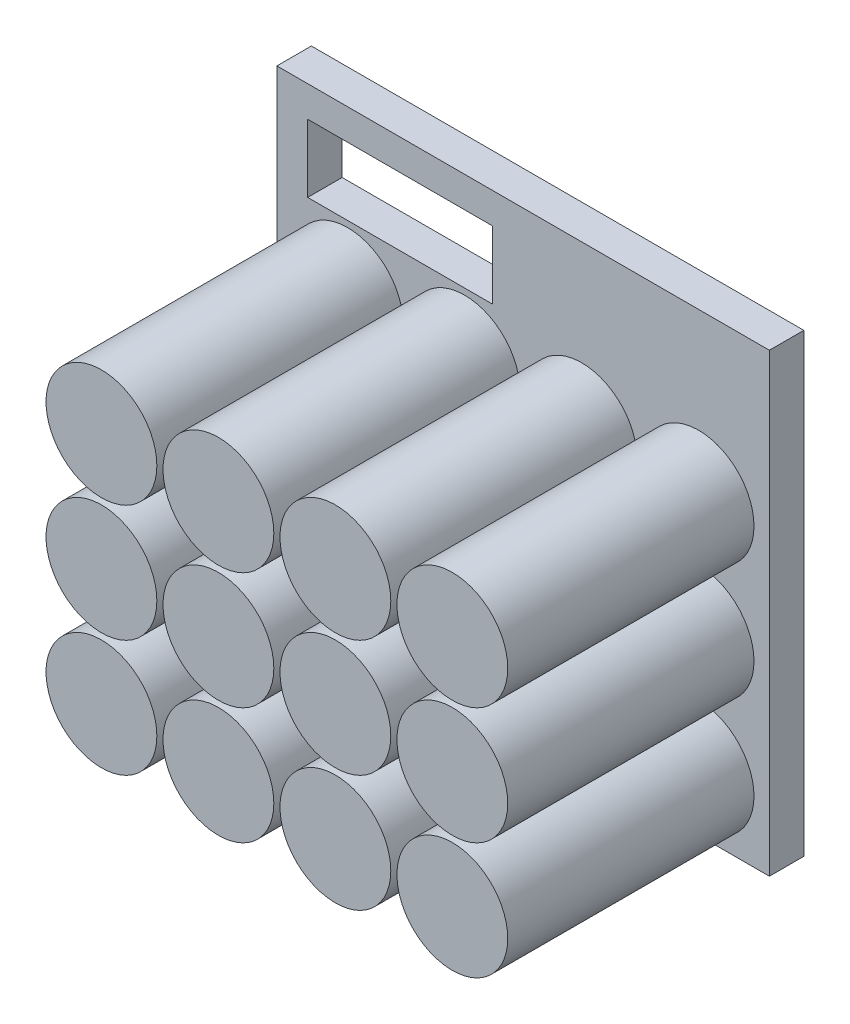
ISO-10303-21;
HEADER;
FILE_DESCRIPTION(('STEP AP214'),'2;1');
FILE_NAME('part.step','',(''),(''),'','','');
FILE_SCHEMA(('AUTOMOTIVE_DESIGN { 1 0 10303 214 1 1 1 1 }'));
ENDSEC;
DATA;
#1=APPLICATION_CONTEXT('core data for automotive mechanical design processes');
#2=APPLICATION_PROTOCOL_DEFINITION('international standard','automotive_design',2000,#1);
#3=PRODUCT_CONTEXT('',#1,'mechanical');
#4=PRODUCT('Part','Part','',(#3));
#5=PRODUCT_RELATED_PRODUCT_CATEGORY('part','',(#4));
#6=PRODUCT_DEFINITION_FORMATION('','',#4);
#7=PRODUCT_DEFINITION_CONTEXT('part definition',#1,'design');
#8=PRODUCT_DEFINITION('design','',#6,#7);
#9=PRODUCT_DEFINITION_SHAPE('','',#8);
#10=(LENGTH_UNIT() NAMED_UNIT(*) SI_UNIT(.MILLI.,.METRE.));
#11=(NAMED_UNIT(*) PLANE_ANGLE_UNIT() SI_UNIT($,.RADIAN.));
#12=(NAMED_UNIT(*) SI_UNIT($,.STERADIAN.) SOLID_ANGLE_UNIT());
#13=UNCERTAINTY_MEASURE_WITH_UNIT(LENGTH_MEASURE(1.E-05),#10,'distance_accuracy_value','');
#14=(GEOMETRIC_REPRESENTATION_CONTEXT(3) GLOBAL_UNCERTAINTY_ASSIGNED_CONTEXT((#13)) GLOBAL_UNIT_ASSIGNED_CONTEXT((#10,
#11,#12)) REPRESENTATION_CONTEXT('',''));
#15=CARTESIAN_POINT('',(0.,0.,0.));
#16=DIRECTION('',(0.,0.,1.));
#17=DIRECTION('',(1.,0.,0.));
#18=AXIS2_PLACEMENT_3D('',#15,#16,#17);
#19=CARTESIAN_POINT('',(-35.0248756218906,13.6567164179105,-5.6));
#20=DIRECTION('',(-1.,0.,0.));
#21=DIRECTION('',(0.,-1.,0.));
#22=AXIS2_PLACEMENT_3D('',#19,#20,#21);
#23=PLANE('',#22);
#24=DIRECTION('',(0.,-1.,0.));
#25=VECTOR('',#24,1.);
#26=CARTESIAN_POINT('',(-35.0248756218906,13.6567164179105,0.));
#27=LINE('',#26,#25);
#28=CARTESIAN_POINT('',(-35.0248756218906,13.6567164179105,0.));
#29=VERTEX_POINT('',#28);
#30=CARTESIAN_POINT('',(-35.0248756218906,-60.3432835820895,0.));
#31=VERTEX_POINT('',#30);
#32=EDGE_CURVE('E137',#29,#31,#27,.T.);
#33=ORIENTED_EDGE('',*,*,#32,.F.);
#34=DIRECTION('',(0.,0.,1.));
#35=VECTOR('',#34,1.);
#36=CARTESIAN_POINT('',(-35.0248756218906,13.6567164179105,-5.6));
#37=LINE('',#36,#35);
#38=CARTESIAN_POINT('',(-35.0248756218906,13.6567164179105,-5.6));
#39=VERTEX_POINT('',#38);
#40=EDGE_CURVE('E11',#39,#29,#37,.T.);
#41=ORIENTED_EDGE('',*,*,#40,.F.);
#42=DIRECTION('',(0.,-1.,0.));
#43=VECTOR('',#42,1.);
#44=CARTESIAN_POINT('',(-35.0248756218906,13.6567164179105,-5.6));
#45=LINE('',#44,#43);
#46=CARTESIAN_POINT('',(-35.0248756218906,-60.3432835820895,-5.6));
#47=VERTEX_POINT('',#46);
#48=EDGE_CURVE('E141',#39,#47,#45,.T.);
#49=ORIENTED_EDGE('',*,*,#48,.T.);
#50=DIRECTION('',(0.,0.,1.));
#51=VECTOR('',#50,1.);
#52=CARTESIAN_POINT('',(-35.0248756218906,-60.3432835820895,-5.6));
#53=LINE('',#52,#51);
#54=EDGE_CURVE('E38',#47,#31,#53,.T.);
#55=ORIENTED_EDGE('',*,*,#54,.T.);
#56=EDGE_LOOP('',(#33,#41,#49,#55));
#57=FACE_BOUND('',#56,.T.);
#58=ADVANCED_FACE('F35',(#57),#23,.T.);
#59=CARTESIAN_POINT('',(-35.0248756218906,13.6567164179105,-5.6));
#60=DIRECTION('',(0.,1.,0.));
#61=DIRECTION('',(0.,0.,1.));
#62=AXIS2_PLACEMENT_3D('',#59,#60,#61);
#63=PLANE('',#62);
#64=DIRECTION('',(-1.,0.,0.));
#65=VECTOR('',#64,1.);
#66=CARTESIAN_POINT('',(-35.0248756218906,13.6567164179105,0.));
#67=LINE('',#66,#65);
#68=CARTESIAN_POINT('',(44.9751243781094,13.6567164179105,0.));
#69=VERTEX_POINT('',#68);
#70=EDGE_CURVE('E145',#69,#29,#67,.T.);
#71=ORIENTED_EDGE('',*,*,#70,.F.);
#72=DIRECTION('',(0.,0.,1.));
#73=VECTOR('',#72,1.);
#74=CARTESIAN_POINT('',(44.9751243781094,13.6567164179105,-5.6));
#75=LINE('',#74,#73);
#76=CARTESIAN_POINT('',(44.9751243781094,13.6567164179105,-5.6));
#77=VERTEX_POINT('',#76);
#78=EDGE_CURVE('E43',#77,#69,#75,.T.);
#79=ORIENTED_EDGE('',*,*,#78,.F.);
#80=DIRECTION('',(-1.,0.,0.));
#81=VECTOR('',#80,1.);
#82=CARTESIAN_POINT('',(-35.0248756218906,13.6567164179105,-5.6));
#83=LINE('',#82,#81);
#84=EDGE_CURVE('E151',#77,#39,#83,.T.);
#85=ORIENTED_EDGE('',*,*,#84,.T.);
#86=ORIENTED_EDGE('',*,*,#40,.T.);
#87=EDGE_LOOP('',(#71,#79,#85,#86));
#88=FACE_BOUND('',#87,.T.);
#89=ADVANCED_FACE('F177',(#88),#63,.T.);
#90=CARTESIAN_POINT('',(44.9751243781094,13.6567164179105,-5.6));
#91=DIRECTION('',(1.,0.,0.));
#92=DIRECTION('',(0.,1.,0.));
#93=AXIS2_PLACEMENT_3D('',#90,#91,#92);
#94=PLANE('',#93);
#95=DIRECTION('',(0.,1.,0.));
#96=VECTOR('',#95,1.);
#97=CARTESIAN_POINT('',(44.9751243781094,13.6567164179105,0.));
#98=LINE('',#97,#96);
#99=CARTESIAN_POINT('',(44.9751243781094,-60.3432835820895,0.));
#100=VERTEX_POINT('',#99);
#101=EDGE_CURVE('E159',#100,#69,#98,.T.);
#102=ORIENTED_EDGE('',*,*,#101,.F.);
#103=DIRECTION('',(0.,0.,1.));
#104=VECTOR('',#103,1.);
#105=CARTESIAN_POINT('',(44.9751243781094,-60.3432835820895,-5.6));
#106=LINE('',#105,#104);
#107=CARTESIAN_POINT('',(44.9751243781094,-60.3432835820895,-5.6));
#108=VERTEX_POINT('',#107);
#109=EDGE_CURVE('E164',#108,#100,#106,.T.);
#110=ORIENTED_EDGE('',*,*,#109,.F.);
#111=DIRECTION('',(0.,1.,0.));
#112=VECTOR('',#111,1.);
#113=CARTESIAN_POINT('',(44.9751243781094,13.6567164179105,-5.6));
#114=LINE('',#113,#112);
#115=EDGE_CURVE('E148',#108,#77,#114,.T.);
#116=ORIENTED_EDGE('',*,*,#115,.T.);
#117=ORIENTED_EDGE('',*,*,#78,.T.);
#118=EDGE_LOOP('',(#102,#110,#116,#117));
#119=FACE_BOUND('',#118,.T.);
#120=ADVANCED_FACE('F181',(#119),#94,.T.);
#121=CARTESIAN_POINT('',(-35.0248756218906,-60.3432835820895,-5.6));
#122=DIRECTION('',(0.,-1.,0.));
#123=DIRECTION('',(0.,0.,-1.));
#124=AXIS2_PLACEMENT_3D('',#121,#122,#123);
#125=PLANE('',#124);
#126=DIRECTION('',(1.,0.,0.));
#127=VECTOR('',#126,1.);
#128=CARTESIAN_POINT('',(-35.0248756218906,-60.3432835820895,0.));
#129=LINE('',#128,#127);
#130=EDGE_CURVE('E156',#31,#100,#129,.T.);
#131=ORIENTED_EDGE('',*,*,#130,.F.);
#132=ORIENTED_EDGE('',*,*,#54,.F.);
#133=DIRECTION('',(1.,0.,0.));
#134=VECTOR('',#133,1.);
#135=CARTESIAN_POINT('',(-35.0248756218906,-60.3432835820895,-5.6));
#136=LINE('',#135,#134);
#137=EDGE_CURVE('E144',#47,#108,#136,.T.);
#138=ORIENTED_EDGE('',*,*,#137,.T.);
#139=ORIENTED_EDGE('',*,*,#109,.T.);
#140=EDGE_LOOP('',(#131,#132,#138,#139));
#141=FACE_BOUND('',#140,.T.);
#142=ADVANCED_FACE('F172',(#141),#125,.T.);
#143=CARTESIAN_POINT('',(0.,0.,-5.6));
#144=DIRECTION('',(0.,0.,1.));
#145=DIRECTION('',(1.,0.,0.));
#146=AXIS2_PLACEMENT_3D('',#143,#144,#145);
#147=PLANE('',#146);
#148=DIRECTION('',(-1.,0.,0.));
#149=VECTOR('',#148,1.);
#150=CARTESIAN_POINT('',(-30.0248756218906,8.65671641791045,-5.6));
#151=LINE('',#150,#149);
#152=CARTESIAN_POINT('',(-0.0248756218905726,8.65671641791045,-5.6));
#153=VERTEX_POINT('',#152);
#154=CARTESIAN_POINT('',(-30.0248756218906,8.65671641791045,-5.6));
#155=VERTEX_POINT('',#154);
#156=EDGE_CURVE('E108',#153,#155,#151,.T.);
#157=ORIENTED_EDGE('',*,*,#156,.T.);
#158=DIRECTION('',(0.,-1.,0.));
#159=VECTOR('',#158,1.);
#160=CARTESIAN_POINT('',(-30.0248756218906,8.65671641791045,-5.6));
#161=LINE('',#160,#159);
#162=CARTESIAN_POINT('',(-30.0248756218906,-2.34328358208955,-5.6));
#163=VERTEX_POINT('',#162);
#164=EDGE_CURVE('E102',#155,#163,#161,.T.);
#165=ORIENTED_EDGE('',*,*,#164,.T.);
#166=DIRECTION('',(1.,0.,0.));
#167=VECTOR('',#166,1.);
#168=CARTESIAN_POINT('',(-30.0248756218906,-2.34328358208955,-5.6));
#169=LINE('',#168,#167);
#170=CARTESIAN_POINT('',(-0.0248756218905674,-2.34328358208955,-5.6));
#171=VERTEX_POINT('',#170);
#172=EDGE_CURVE('E111',#163,#171,#169,.T.);
#173=ORIENTED_EDGE('',*,*,#172,.T.);
#174=DIRECTION('',(0.,1.,0.));
#175=VECTOR('',#174,1.);
#176=CARTESIAN_POINT('',(-0.0248756218905726,8.65671641791045,-5.6));
#177=LINE('',#176,#175);
#178=EDGE_CURVE('E51',#171,#153,#177,.T.);
#179=ORIENTED_EDGE('',*,*,#178,.T.);
#180=EDGE_LOOP('',(#157,#165,#173,#179));
#181=FACE_BOUND('',#180,.T.);
#182=ORIENTED_EDGE('',*,*,#48,.F.);
#183=ORIENTED_EDGE('',*,*,#84,.F.);
#184=ORIENTED_EDGE('',*,*,#115,.F.);
#185=ORIENTED_EDGE('',*,*,#137,.F.);
#186=EDGE_LOOP('',(#182,#183,#184,#185));
#187=FACE_BOUND('',#186,.T.);
#188=ADVANCED_FACE('F115',(#181,#187),#147,.F.);
#189=CARTESIAN_POINT('',(0.,0.,0.));
#190=DIRECTION('',(0.,0.,1.));
#191=DIRECTION('',(1.,0.,0.));
#192=AXIS2_PLACEMENT_3D('',#189,#190,#191);
#193=PLANE('',#192);
#194=CARTESIAN_POINT('',(33.4751243781094,-50.3432835820895,0.));
#195=DIRECTION('',(0.,0.,1.));
#196=DIRECTION('',(1.,0.,0.));
#197=AXIS2_PLACEMENT_3D('',#194,#195,#196);
#198=CIRCLE('',#197,9.);
#199=CARTESIAN_POINT('',(42.4751243781094,-50.3432835820895,0.));
#200=VERTEX_POINT('',#199);
#201=EDGE_CURVE('E506',#200,#200,#198,.T.);
#202=ORIENTED_EDGE('',*,*,#201,.F.);
#203=EDGE_LOOP('',(#202));
#204=FACE_BOUND('',#203,.T.);
#205=CARTESIAN_POINT('',(33.4751243781094,-31.3432835820895,0.));
#206=DIRECTION('',(0.,0.,1.));
#207=DIRECTION('',(1.,0.,0.));
#208=AXIS2_PLACEMENT_3D('',#205,#206,#207);
#209=CIRCLE('',#208,9.);
#210=CARTESIAN_POINT('',(42.4751243781094,-31.3432835820895,0.));
#211=VERTEX_POINT('',#210);
#212=EDGE_CURVE('E505',#211,#211,#209,.T.);
#213=ORIENTED_EDGE('',*,*,#212,.F.);
#214=EDGE_LOOP('',(#213));
#215=FACE_BOUND('',#214,.T.);
#216=CARTESIAN_POINT('',(33.4751243781093,-12.3432835820895,0.));
#217=DIRECTION('',(0.,0.,1.));
#218=DIRECTION('',(1.,0.,0.));
#219=AXIS2_PLACEMENT_3D('',#216,#217,#218);
#220=CIRCLE('',#219,9.);
#221=CARTESIAN_POINT('',(42.4751243781093,-12.3432835820895,0.));
#222=VERTEX_POINT('',#221);
#223=EDGE_CURVE('E515',#222,#222,#220,.T.);
#224=ORIENTED_EDGE('',*,*,#223,.F.);
#225=EDGE_LOOP('',(#224));
#226=FACE_BOUND('',#225,.T.);
#227=CARTESIAN_POINT('',(14.4751243781093,-12.3432835820895,0.));
#228=DIRECTION('',(0.,0.,1.));
#229=DIRECTION('',(1.,0.,0.));
#230=AXIS2_PLACEMENT_3D('',#227,#228,#229);
#231=CIRCLE('',#230,9.);
#232=CARTESIAN_POINT('',(23.4751243781093,-12.3432835820895,0.));
#233=VERTEX_POINT('',#232);
#234=EDGE_CURVE('E520',#233,#233,#231,.T.);
#235=ORIENTED_EDGE('',*,*,#234,.F.);
#236=EDGE_LOOP('',(#235));
#237=FACE_BOUND('',#236,.T.);
#238=CARTESIAN_POINT('',(14.4751243781094,-31.3432835820895,0.));
#239=DIRECTION('',(0.,0.,1.));
#240=DIRECTION('',(1.,0.,0.));
#241=AXIS2_PLACEMENT_3D('',#238,#239,#240);
#242=CIRCLE('',#241,9.);
#243=CARTESIAN_POINT('',(23.4751243781094,-31.3432835820895,0.));
#244=VERTEX_POINT('',#243);
#245=EDGE_CURVE('E526',#244,#244,#242,.T.);
#246=ORIENTED_EDGE('',*,*,#245,.F.);
#247=EDGE_LOOP('',(#246));
#248=FACE_BOUND('',#247,.T.);
#249=CARTESIAN_POINT('',(14.4751243781094,-50.3432835820895,0.));
#250=DIRECTION('',(0.,0.,1.));
#251=DIRECTION('',(1.,0.,0.));
#252=AXIS2_PLACEMENT_3D('',#249,#250,#251);
#253=CIRCLE('',#252,9.);
#254=CARTESIAN_POINT('',(23.4751243781094,-50.3432835820895,0.));
#255=VERTEX_POINT('',#254);
#256=EDGE_CURVE('E532',#255,#255,#253,.T.);
#257=ORIENTED_EDGE('',*,*,#256,.F.);
#258=EDGE_LOOP('',(#257));
#259=FACE_BOUND('',#258,.T.);
#260=CARTESIAN_POINT('',(-4.52487562189056,-50.3432835820895,0.));
#261=DIRECTION('',(0.,0.,1.));
#262=DIRECTION('',(1.,0.,0.));
#263=AXIS2_PLACEMENT_3D('',#260,#261,#262);
#264=CIRCLE('',#263,9.);
#265=CARTESIAN_POINT('',(4.47512437810944,-50.3432835820895,0.));
#266=VERTEX_POINT('',#265);
#267=EDGE_CURVE('E538',#266,#266,#264,.T.);
#268=ORIENTED_EDGE('',*,*,#267,.F.);
#269=EDGE_LOOP('',(#268));
#270=FACE_BOUND('',#269,.T.);
#271=CARTESIAN_POINT('',(-4.52487562189063,-31.3432835820895,0.));
#272=DIRECTION('',(0.,0.,1.));
#273=DIRECTION('',(1.,0.,0.));
#274=AXIS2_PLACEMENT_3D('',#271,#272,#273);
#275=CIRCLE('',#274,9.);
#276=CARTESIAN_POINT('',(4.47512437810937,-31.3432835820895,0.));
#277=VERTEX_POINT('',#276);
#278=EDGE_CURVE('E544',#277,#277,#275,.T.);
#279=ORIENTED_EDGE('',*,*,#278,.F.);
#280=EDGE_LOOP('',(#279));
#281=FACE_BOUND('',#280,.T.);
#282=CARTESIAN_POINT('',(-4.52487562189069,-12.3432835820895,0.));
#283=DIRECTION('',(0.,0.,1.));
#284=DIRECTION('',(1.,0.,0.));
#285=AXIS2_PLACEMENT_3D('',#282,#283,#284);
#286=CIRCLE('',#285,9.);
#287=CARTESIAN_POINT('',(4.47512437810931,-12.3432835820895,0.));
#288=VERTEX_POINT('',#287);
#289=EDGE_CURVE('E550',#288,#288,#286,.T.);
#290=ORIENTED_EDGE('',*,*,#289,.F.);
#291=EDGE_LOOP('',(#290));
#292=FACE_BOUND('',#291,.T.);
#293=CARTESIAN_POINT('',(-23.5248756218907,-12.3432835820895,0.));
#294=DIRECTION('',(0.,0.,1.));
#295=DIRECTION('',(1.,0.,0.));
#296=AXIS2_PLACEMENT_3D('',#293,#294,#295);
#297=CIRCLE('',#296,9.);
#298=CARTESIAN_POINT('',(-14.5248756218907,-12.3432835820895,0.));
#299=VERTEX_POINT('',#298);
#300=EDGE_CURVE('E556',#299,#299,#297,.T.);
#301=ORIENTED_EDGE('',*,*,#300,.F.);
#302=EDGE_LOOP('',(#301));
#303=FACE_BOUND('',#302,.T.);
#304=CARTESIAN_POINT('',(-23.5248756218906,-31.3432835820895,0.));
#305=DIRECTION('',(0.,0.,1.));
#306=DIRECTION('',(1.,0.,0.));
#307=AXIS2_PLACEMENT_3D('',#304,#305,#306);
#308=CIRCLE('',#307,9.);
#309=CARTESIAN_POINT('',(-14.5248756218906,-31.3432835820895,0.));
#310=VERTEX_POINT('',#309);
#311=EDGE_CURVE('E562',#310,#310,#308,.T.);
#312=ORIENTED_EDGE('',*,*,#311,.F.);
#313=EDGE_LOOP('',(#312));
#314=FACE_BOUND('',#313,.T.);
#315=CARTESIAN_POINT('',(-23.5248756218906,-50.3432835820895,0.));
#316=DIRECTION('',(0.,0.,1.));
#317=DIRECTION('',(1.,0.,0.));
#318=AXIS2_PLACEMENT_3D('',#315,#316,#317);
#319=CIRCLE('',#318,9.);
#320=CARTESIAN_POINT('',(-14.5248756218906,-50.3432835820895,0.));
#321=VERTEX_POINT('',#320);
#322=EDGE_CURVE('E124',#321,#321,#319,.T.);
#323=ORIENTED_EDGE('',*,*,#322,.F.);
#324=EDGE_LOOP('',(#323));
#325=FACE_BOUND('',#324,.T.);
#326=DIRECTION('',(0.,-1.,0.));
#327=VECTOR('',#326,1.);
#328=CARTESIAN_POINT('',(-30.0248756218906,8.65671641791045,0.));
#329=LINE('',#328,#327);
#330=CARTESIAN_POINT('',(-30.0248756218906,8.65671641791045,0.));
#331=VERTEX_POINT('',#330);
#332=CARTESIAN_POINT('',(-30.0248756218906,-2.34328358208955,0.));
#333=VERTEX_POINT('',#332);
#334=EDGE_CURVE('E59',#331,#333,#329,.T.);
#335=ORIENTED_EDGE('',*,*,#334,.F.);
#336=DIRECTION('',(-1.,0.,0.));
#337=VECTOR('',#336,1.);
#338=CARTESIAN_POINT('',(-30.0248756218906,8.65671641791045,0.));
#339=LINE('',#338,#337);
#340=CARTESIAN_POINT('',(-0.0248756218905726,8.65671641791045,0.));
#341=VERTEX_POINT('',#340);
#342=EDGE_CURVE('E118',#341,#331,#339,.T.);
#343=ORIENTED_EDGE('',*,*,#342,.F.);
#344=DIRECTION('',(0.,1.,0.));
#345=VECTOR('',#344,1.);
#346=CARTESIAN_POINT('',(-0.0248756218905726,8.65671641791045,0.));
#347=LINE('',#346,#345);
#348=CARTESIAN_POINT('',(-0.0248756218905674,-2.34328358208955,0.));
#349=VERTEX_POINT('',#348);
#350=EDGE_CURVE('E121',#349,#341,#347,.T.);
#351=ORIENTED_EDGE('',*,*,#350,.F.);
#352=DIRECTION('',(1.,0.,0.));
#353=VECTOR('',#352,1.);
#354=CARTESIAN_POINT('',(-30.0248756218906,-2.34328358208955,0.));
#355=LINE('',#354,#353);
#356=EDGE_CURVE('E130',#333,#349,#355,.T.);
#357=ORIENTED_EDGE('',*,*,#356,.F.);
#358=EDGE_LOOP('',(#335,#343,#351,#357));
#359=FACE_BOUND('',#358,.T.);
#360=ORIENTED_EDGE('',*,*,#32,.T.);
#361=ORIENTED_EDGE('',*,*,#130,.T.);
#362=ORIENTED_EDGE('',*,*,#101,.T.);
#363=ORIENTED_EDGE('',*,*,#70,.T.);
#364=EDGE_LOOP('',(#360,#361,#362,#363));
#365=FACE_BOUND('',#364,.T.);
#366=ADVANCED_FACE('F174',(#204,#215,#226,#237,#248,#259,#270,#281,#292,#303,#314,#325,#359,
#365),#193,.T.);
#367=CARTESIAN_POINT('',(-30.0248756218906,8.65671641791045,-5.6));
#368=DIRECTION('',(-1.,0.,0.));
#369=DIRECTION('',(0.,-1.,0.));
#370=AXIS2_PLACEMENT_3D('',#367,#368,#369);
#371=PLANE('',#370);
#372=ORIENTED_EDGE('',*,*,#334,.T.);
#373=DIRECTION('',(0.,0.,1.));
#374=VECTOR('',#373,1.);
#375=CARTESIAN_POINT('',(-30.0248756218906,-2.34328358208955,-5.6));
#376=LINE('',#375,#374);
#377=EDGE_CURVE('E98',#163,#333,#376,.T.);
#378=ORIENTED_EDGE('',*,*,#377,.F.);
#379=ORIENTED_EDGE('',*,*,#164,.F.);
#380=DIRECTION('',(0.,0.,1.));
#381=VECTOR('',#380,1.);
#382=CARTESIAN_POINT('',(-30.0248756218906,8.65671641791045,-5.6));
#383=LINE('',#382,#381);
#384=EDGE_CURVE('E135',#155,#331,#383,.T.);
#385=ORIENTED_EDGE('',*,*,#384,.T.);
#386=EDGE_LOOP('',(#372,#378,#379,#385));
#387=FACE_BOUND('',#386,.T.);
#388=ADVANCED_FACE('F100',(#387),#371,.F.);
#389=CARTESIAN_POINT('',(-30.0248756218906,8.65671641791045,-5.6));
#390=DIRECTION('',(0.,1.,0.));
#391=DIRECTION('',(0.,0.,1.));
#392=AXIS2_PLACEMENT_3D('',#389,#390,#391);
#393=PLANE('',#392);
#394=ORIENTED_EDGE('',*,*,#342,.T.);
#395=ORIENTED_EDGE('',*,*,#384,.F.);
#396=ORIENTED_EDGE('',*,*,#156,.F.);
#397=DIRECTION('',(0.,0.,1.));
#398=VECTOR('',#397,1.);
#399=CARTESIAN_POINT('',(-0.0248756218905726,8.65671641791045,-5.6));
#400=LINE('',#399,#398);
#401=EDGE_CURVE('E138',#153,#341,#400,.T.);
#402=ORIENTED_EDGE('',*,*,#401,.T.);
#403=EDGE_LOOP('',(#394,#395,#396,#402));
#404=FACE_BOUND('',#403,.T.);
#405=ADVANCED_FACE('F225',(#404),#393,.F.);
#406=CARTESIAN_POINT('',(-0.0248756218905726,8.65671641791045,-5.6));
#407=DIRECTION('',(1.,0.,0.));
#408=DIRECTION('',(0.,1.,0.));
#409=AXIS2_PLACEMENT_3D('',#406,#407,#408);
#410=PLANE('',#409);
#411=ORIENTED_EDGE('',*,*,#350,.T.);
#412=ORIENTED_EDGE('',*,*,#401,.F.);
#413=ORIENTED_EDGE('',*,*,#178,.F.);
#414=DIRECTION('',(0.,0.,1.));
#415=VECTOR('',#414,1.);
#416=CARTESIAN_POINT('',(-0.0248756218905674,-2.34328358208955,-5.6));
#417=LINE('',#416,#415);
#418=EDGE_CURVE('E107',#171,#349,#417,.T.);
#419=ORIENTED_EDGE('',*,*,#418,.T.);
#420=EDGE_LOOP('',(#411,#412,#413,#419));
#421=FACE_BOUND('',#420,.T.);
#422=ADVANCED_FACE('F234',(#421),#410,.F.);
#423=CARTESIAN_POINT('',(-30.0248756218906,-2.34328358208955,-5.6));
#424=DIRECTION('',(0.,-1.,0.));
#425=DIRECTION('',(1.,0.,0.));
#426=AXIS2_PLACEMENT_3D('',#423,#424,#425);
#427=PLANE('',#426);
#428=ORIENTED_EDGE('',*,*,#356,.T.);
#429=ORIENTED_EDGE('',*,*,#418,.F.);
#430=ORIENTED_EDGE('',*,*,#172,.F.);
#431=ORIENTED_EDGE('',*,*,#377,.T.);
#432=EDGE_LOOP('',(#428,#429,#430,#431));
#433=FACE_BOUND('',#432,.T.);
#434=ADVANCED_FACE('F112',(#433),#427,.F.);
#435=CARTESIAN_POINT('',(-23.5248756218906,-50.3432835820895,40.));
#436=DIRECTION('',(0.,0.,-1.));
#437=DIRECTION('',(-1.,0.,0.));
#438=AXIS2_PLACEMENT_3D('',#435,#436,#437);
#439=CYLINDRICAL_SURFACE('',#438,9.);
#440=CARTESIAN_POINT('',(-23.5248756218906,-50.3432835820895,40.));
#441=DIRECTION('',(0.,0.,1.));
#442=DIRECTION('',(1.,0.,0.));
#443=AXIS2_PLACEMENT_3D('',#440,#441,#442);
#444=CIRCLE('',#443,9.);
#445=CARTESIAN_POINT('',(-14.5248756218906,-50.3432835820895,40.));
#446=VERTEX_POINT('',#445);
#447=EDGE_CURVE('E131',#446,#446,#444,.T.);
#448=ORIENTED_EDGE('',*,*,#447,.F.);
#449=EDGE_LOOP('',(#448));
#450=FACE_BOUND('',#449,.T.);
#451=ORIENTED_EDGE('',*,*,#322,.T.);
#452=EDGE_LOOP('',(#451));
#453=FACE_BOUND('',#452,.T.);
#454=ADVANCED_FACE('F252',(#450,#453),#439,.T.);
#455=CARTESIAN_POINT('',(0.,0.,40.));
#456=DIRECTION('',(0.,0.,1.));
#457=DIRECTION('',(1.,0.,0.));
#458=AXIS2_PLACEMENT_3D('',#455,#456,#457);
#459=PLANE('',#458);
#460=ORIENTED_EDGE('',*,*,#447,.T.);
#461=EDGE_LOOP('',(#460));
#462=FACE_BOUND('',#461,.T.);
#463=ADVANCED_FACE('F268',(#462),#459,.T.);
#464=CARTESIAN_POINT('',(-23.5248756218906,-31.3432835820895,40.));
#465=DIRECTION('',(0.,0.,-1.));
#466=DIRECTION('',(-1.,0.,0.));
#467=AXIS2_PLACEMENT_3D('',#464,#465,#466);
#468=CYLINDRICAL_SURFACE('',#467,9.);
#469=CARTESIAN_POINT('',(-23.5248756218906,-31.3432835820895,40.));
#470=DIRECTION('',(0.,0.,1.));
#471=DIRECTION('',(1.,0.,0.));
#472=AXIS2_PLACEMENT_3D('',#469,#470,#471);
#473=CIRCLE('',#472,9.);
#474=CARTESIAN_POINT('',(-14.5248756218906,-31.3432835820895,40.));
#475=VERTEX_POINT('',#474);
#476=EDGE_CURVE('E565',#475,#475,#473,.T.);
#477=ORIENTED_EDGE('',*,*,#476,.F.);
#478=EDGE_LOOP('',(#477));
#479=FACE_BOUND('',#478,.T.);
#480=ORIENTED_EDGE('',*,*,#311,.T.);
#481=EDGE_LOOP('',(#480));
#482=FACE_BOUND('',#481,.T.);
#483=ADVANCED_FACE('F278',(#479,#482),#468,.T.);
#484=CARTESIAN_POINT('',(0.,0.,40.));
#485=DIRECTION('',(0.,0.,1.));
#486=DIRECTION('',(1.,0.,0.));
#487=AXIS2_PLACEMENT_3D('',#484,#485,#486);
#488=PLANE('',#487);
#489=ORIENTED_EDGE('',*,*,#476,.T.);
#490=EDGE_LOOP('',(#489));
#491=FACE_BOUND('',#490,.T.);
#492=ADVANCED_FACE('F288',(#491),#488,.T.);
#493=CARTESIAN_POINT('',(-23.5248756218907,-12.3432835820895,40.));
#494=DIRECTION('',(0.,0.,-1.));
#495=DIRECTION('',(-1.,0.,0.));
#496=AXIS2_PLACEMENT_3D('',#493,#494,#495);
#497=CYLINDRICAL_SURFACE('',#496,9.);
#498=CARTESIAN_POINT('',(-23.5248756218907,-12.3432835820895,40.));
#499=DIRECTION('',(0.,0.,1.));
#500=DIRECTION('',(1.,0.,0.));
#501=AXIS2_PLACEMENT_3D('',#498,#499,#500);
#502=CIRCLE('',#501,9.);
#503=CARTESIAN_POINT('',(-14.5248756218907,-12.3432835820895,40.));
#504=VERTEX_POINT('',#503);
#505=EDGE_CURVE('E559',#504,#504,#502,.T.);
#506=ORIENTED_EDGE('',*,*,#505,.F.);
#507=EDGE_LOOP('',(#506));
#508=FACE_BOUND('',#507,.T.);
#509=ORIENTED_EDGE('',*,*,#300,.T.);
#510=EDGE_LOOP('',(#509));
#511=FACE_BOUND('',#510,.T.);
#512=ADVANCED_FACE('F298',(#508,#511),#497,.T.);
#513=CARTESIAN_POINT('',(0.,0.,40.));
#514=DIRECTION('',(0.,0.,1.));
#515=DIRECTION('',(1.,0.,0.));
#516=AXIS2_PLACEMENT_3D('',#513,#514,#515);
#517=PLANE('',#516);
#518=ORIENTED_EDGE('',*,*,#505,.T.);
#519=EDGE_LOOP('',(#518));
#520=FACE_BOUND('',#519,.T.);
#521=ADVANCED_FACE('F308',(#520),#517,.T.);
#522=CARTESIAN_POINT('',(-4.52487562189069,-12.3432835820895,40.));
#523=DIRECTION('',(0.,0.,-1.));
#524=DIRECTION('',(-1.,0.,0.));
#525=AXIS2_PLACEMENT_3D('',#522,#523,#524);
#526=CYLINDRICAL_SURFACE('',#525,9.);
#527=CARTESIAN_POINT('',(-4.52487562189069,-12.3432835820895,40.));
#528=DIRECTION('',(0.,0.,1.));
#529=DIRECTION('',(1.,0.,0.));
#530=AXIS2_PLACEMENT_3D('',#527,#528,#529);
#531=CIRCLE('',#530,9.);
#532=CARTESIAN_POINT('',(4.47512437810931,-12.3432835820895,40.));
#533=VERTEX_POINT('',#532);
#534=EDGE_CURVE('E553',#533,#533,#531,.T.);
#535=ORIENTED_EDGE('',*,*,#534,.F.);
#536=EDGE_LOOP('',(#535));
#537=FACE_BOUND('',#536,.T.);
#538=ORIENTED_EDGE('',*,*,#289,.T.);
#539=EDGE_LOOP('',(#538));
#540=FACE_BOUND('',#539,.T.);
#541=ADVANCED_FACE('F318',(#537,#540),#526,.T.);
#542=CARTESIAN_POINT('',(0.,0.,40.));
#543=DIRECTION('',(0.,0.,1.));
#544=DIRECTION('',(1.,0.,0.));
#545=AXIS2_PLACEMENT_3D('',#542,#543,#544);
#546=PLANE('',#545);
#547=ORIENTED_EDGE('',*,*,#534,.T.);
#548=EDGE_LOOP('',(#547));
#549=FACE_BOUND('',#548,.T.);
#550=ADVANCED_FACE('F328',(#549),#546,.T.);
#551=CARTESIAN_POINT('',(-4.52487562189063,-31.3432835820895,40.));
#552=DIRECTION('',(0.,0.,-1.));
#553=DIRECTION('',(-1.,0.,0.));
#554=AXIS2_PLACEMENT_3D('',#551,#552,#553);
#555=CYLINDRICAL_SURFACE('',#554,9.);
#556=CARTESIAN_POINT('',(-4.52487562189063,-31.3432835820895,40.));
#557=DIRECTION('',(0.,0.,1.));
#558=DIRECTION('',(1.,0.,0.));
#559=AXIS2_PLACEMENT_3D('',#556,#557,#558);
#560=CIRCLE('',#559,9.);
#561=CARTESIAN_POINT('',(4.47512437810937,-31.3432835820895,40.));
#562=VERTEX_POINT('',#561);
#563=EDGE_CURVE('E547',#562,#562,#560,.T.);
#564=ORIENTED_EDGE('',*,*,#563,.F.);
#565=EDGE_LOOP('',(#564));
#566=FACE_BOUND('',#565,.T.);
#567=ORIENTED_EDGE('',*,*,#278,.T.);
#568=EDGE_LOOP('',(#567));
#569=FACE_BOUND('',#568,.T.);
#570=ADVANCED_FACE('F338',(#566,#569),#555,.T.);
#571=CARTESIAN_POINT('',(0.,0.,40.));
#572=DIRECTION('',(0.,0.,1.));
#573=DIRECTION('',(1.,0.,0.));
#574=AXIS2_PLACEMENT_3D('',#571,#572,#573);
#575=PLANE('',#574);
#576=ORIENTED_EDGE('',*,*,#563,.T.);
#577=EDGE_LOOP('',(#576));
#578=FACE_BOUND('',#577,.T.);
#579=ADVANCED_FACE('F348',(#578),#575,.T.);
#580=CARTESIAN_POINT('',(-4.52487562189056,-50.3432835820895,40.));
#581=DIRECTION('',(0.,0.,-1.));
#582=DIRECTION('',(-1.,0.,0.));
#583=AXIS2_PLACEMENT_3D('',#580,#581,#582);
#584=CYLINDRICAL_SURFACE('',#583,9.);
#585=CARTESIAN_POINT('',(-4.52487562189056,-50.3432835820895,40.));
#586=DIRECTION('',(0.,0.,1.));
#587=DIRECTION('',(1.,0.,0.));
#588=AXIS2_PLACEMENT_3D('',#585,#586,#587);
#589=CIRCLE('',#588,9.);
#590=CARTESIAN_POINT('',(4.47512437810944,-50.3432835820895,40.));
#591=VERTEX_POINT('',#590);
#592=EDGE_CURVE('E541',#591,#591,#589,.T.);
#593=ORIENTED_EDGE('',*,*,#592,.F.);
#594=EDGE_LOOP('',(#593));
#595=FACE_BOUND('',#594,.T.);
#596=ORIENTED_EDGE('',*,*,#267,.T.);
#597=EDGE_LOOP('',(#596));
#598=FACE_BOUND('',#597,.T.);
#599=ADVANCED_FACE('F358',(#595,#598),#584,.T.);
#600=CARTESIAN_POINT('',(0.,0.,40.));
#601=DIRECTION('',(0.,0.,1.));
#602=DIRECTION('',(1.,0.,0.));
#603=AXIS2_PLACEMENT_3D('',#600,#601,#602);
#604=PLANE('',#603);
#605=ORIENTED_EDGE('',*,*,#592,.T.);
#606=EDGE_LOOP('',(#605));
#607=FACE_BOUND('',#606,.T.);
#608=ADVANCED_FACE('F368',(#607),#604,.T.);
#609=CARTESIAN_POINT('',(14.4751243781094,-50.3432835820895,40.));
#610=DIRECTION('',(0.,0.,-1.));
#611=DIRECTION('',(-1.,0.,0.));
#612=AXIS2_PLACEMENT_3D('',#609,#610,#611);
#613=CYLINDRICAL_SURFACE('',#612,9.);
#614=CARTESIAN_POINT('',(14.4751243781094,-50.3432835820895,40.));
#615=DIRECTION('',(0.,0.,1.));
#616=DIRECTION('',(1.,0.,0.));
#617=AXIS2_PLACEMENT_3D('',#614,#615,#616);
#618=CIRCLE('',#617,9.);
#619=CARTESIAN_POINT('',(23.4751243781094,-50.3432835820895,40.));
#620=VERTEX_POINT('',#619);
#621=EDGE_CURVE('E535',#620,#620,#618,.T.);
#622=ORIENTED_EDGE('',*,*,#621,.F.);
#623=EDGE_LOOP('',(#622));
#624=FACE_BOUND('',#623,.T.);
#625=ORIENTED_EDGE('',*,*,#256,.T.);
#626=EDGE_LOOP('',(#625));
#627=FACE_BOUND('',#626,.T.);
#628=ADVANCED_FACE('F378',(#624,#627),#613,.T.);
#629=CARTESIAN_POINT('',(0.,0.,40.));
#630=DIRECTION('',(0.,0.,1.));
#631=DIRECTION('',(1.,0.,0.));
#632=AXIS2_PLACEMENT_3D('',#629,#630,#631);
#633=PLANE('',#632);
#634=ORIENTED_EDGE('',*,*,#621,.T.);
#635=EDGE_LOOP('',(#634));
#636=FACE_BOUND('',#635,.T.);
#637=ADVANCED_FACE('F388',(#636),#633,.T.);
#638=CARTESIAN_POINT('',(14.4751243781094,-31.3432835820895,40.));
#639=DIRECTION('',(0.,0.,-1.));
#640=DIRECTION('',(-1.,0.,0.));
#641=AXIS2_PLACEMENT_3D('',#638,#639,#640);
#642=CYLINDRICAL_SURFACE('',#641,9.);
#643=CARTESIAN_POINT('',(14.4751243781094,-31.3432835820895,40.));
#644=DIRECTION('',(0.,0.,1.));
#645=DIRECTION('',(1.,0.,0.));
#646=AXIS2_PLACEMENT_3D('',#643,#644,#645);
#647=CIRCLE('',#646,9.);
#648=CARTESIAN_POINT('',(23.4751243781094,-31.3432835820895,40.));
#649=VERTEX_POINT('',#648);
#650=EDGE_CURVE('E529',#649,#649,#647,.T.);
#651=ORIENTED_EDGE('',*,*,#650,.F.);
#652=EDGE_LOOP('',(#651));
#653=FACE_BOUND('',#652,.T.);
#654=ORIENTED_EDGE('',*,*,#245,.T.);
#655=EDGE_LOOP('',(#654));
#656=FACE_BOUND('',#655,.T.);
#657=ADVANCED_FACE('F398',(#653,#656),#642,.T.);
#658=CARTESIAN_POINT('',(0.,0.,40.));
#659=DIRECTION('',(0.,0.,1.));
#660=DIRECTION('',(1.,0.,0.));
#661=AXIS2_PLACEMENT_3D('',#658,#659,#660);
#662=PLANE('',#661);
#663=ORIENTED_EDGE('',*,*,#650,.T.);
#664=EDGE_LOOP('',(#663));
#665=FACE_BOUND('',#664,.T.);
#666=ADVANCED_FACE('F408',(#665),#662,.T.);
#667=CARTESIAN_POINT('',(14.4751243781093,-12.3432835820895,40.));
#668=DIRECTION('',(0.,0.,-1.));
#669=DIRECTION('',(-1.,0.,0.));
#670=AXIS2_PLACEMENT_3D('',#667,#668,#669);
#671=CYLINDRICAL_SURFACE('',#670,9.);
#672=CARTESIAN_POINT('',(14.4751243781093,-12.3432835820895,40.));
#673=DIRECTION('',(0.,0.,1.));
#674=DIRECTION('',(1.,0.,0.));
#675=AXIS2_PLACEMENT_3D('',#672,#673,#674);
#676=CIRCLE('',#675,9.);
#677=CARTESIAN_POINT('',(23.4751243781093,-12.3432835820895,40.));
#678=VERTEX_POINT('',#677);
#679=EDGE_CURVE('E523',#678,#678,#676,.T.);
#680=ORIENTED_EDGE('',*,*,#679,.F.);
#681=EDGE_LOOP('',(#680));
#682=FACE_BOUND('',#681,.T.);
#683=ORIENTED_EDGE('',*,*,#234,.T.);
#684=EDGE_LOOP('',(#683));
#685=FACE_BOUND('',#684,.T.);
#686=ADVANCED_FACE('F418',(#682,#685),#671,.T.);
#687=CARTESIAN_POINT('',(0.,0.,40.));
#688=DIRECTION('',(0.,0.,1.));
#689=DIRECTION('',(1.,0.,0.));
#690=AXIS2_PLACEMENT_3D('',#687,#688,#689);
#691=PLANE('',#690);
#692=ORIENTED_EDGE('',*,*,#679,.T.);
#693=EDGE_LOOP('',(#692));
#694=FACE_BOUND('',#693,.T.);
#695=ADVANCED_FACE('F428',(#694),#691,.T.);
#696=CARTESIAN_POINT('',(33.4751243781093,-12.3432835820895,40.));
#697=DIRECTION('',(0.,0.,-1.));
#698=DIRECTION('',(-1.,0.,0.));
#699=AXIS2_PLACEMENT_3D('',#696,#697,#698);
#700=CYLINDRICAL_SURFACE('',#699,9.);
#701=CARTESIAN_POINT('',(33.4751243781093,-12.3432835820895,40.));
#702=DIRECTION('',(0.,0.,1.));
#703=DIRECTION('',(1.,0.,0.));
#704=AXIS2_PLACEMENT_3D('',#701,#702,#703);
#705=CIRCLE('',#704,9.);
#706=CARTESIAN_POINT('',(42.4751243781093,-12.3432835820895,40.));
#707=VERTEX_POINT('',#706);
#708=EDGE_CURVE('E517',#707,#707,#705,.T.);
#709=ORIENTED_EDGE('',*,*,#708,.F.);
#710=EDGE_LOOP('',(#709));
#711=FACE_BOUND('',#710,.T.);
#712=ORIENTED_EDGE('',*,*,#223,.T.);
#713=EDGE_LOOP('',(#712));
#714=FACE_BOUND('',#713,.T.);
#715=ADVANCED_FACE('F438',(#711,#714),#700,.T.);
#716=CARTESIAN_POINT('',(0.,0.,40.));
#717=DIRECTION('',(0.,0.,1.));
#718=DIRECTION('',(1.,0.,0.));
#719=AXIS2_PLACEMENT_3D('',#716,#717,#718);
#720=PLANE('',#719);
#721=ORIENTED_EDGE('',*,*,#708,.T.);
#722=EDGE_LOOP('',(#721));
#723=FACE_BOUND('',#722,.T.);
#724=ADVANCED_FACE('F448',(#723),#720,.T.);
#725=CARTESIAN_POINT('',(33.4751243781094,-31.3432835820895,40.));
#726=DIRECTION('',(0.,0.,-1.));
#727=DIRECTION('',(-1.,0.,0.));
#728=AXIS2_PLACEMENT_3D('',#725,#726,#727);
#729=CYLINDRICAL_SURFACE('',#728,9.);
#730=CARTESIAN_POINT('',(33.4751243781094,-31.3432835820895,40.));
#731=DIRECTION('',(0.,0.,1.));
#732=DIRECTION('',(1.,0.,0.));
#733=AXIS2_PLACEMENT_3D('',#730,#731,#732);
#734=CIRCLE('',#733,9.);
#735=CARTESIAN_POINT('',(42.4751243781094,-31.3432835820895,40.));
#736=VERTEX_POINT('',#735);
#737=EDGE_CURVE('E509',#736,#736,#734,.T.);
#738=ORIENTED_EDGE('',*,*,#737,.F.);
#739=EDGE_LOOP('',(#738));
#740=FACE_BOUND('',#739,.T.);
#741=ORIENTED_EDGE('',*,*,#212,.T.);
#742=EDGE_LOOP('',(#741));
#743=FACE_BOUND('',#742,.T.);
#744=ADVANCED_FACE('F458',(#740,#743),#729,.T.);
#745=CARTESIAN_POINT('',(0.,0.,40.));
#746=DIRECTION('',(0.,0.,1.));
#747=DIRECTION('',(1.,0.,0.));
#748=AXIS2_PLACEMENT_3D('',#745,#746,#747);
#749=PLANE('',#748);
#750=ORIENTED_EDGE('',*,*,#737,.T.);
#751=EDGE_LOOP('',(#750));
#752=FACE_BOUND('',#751,.T.);
#753=ADVANCED_FACE('F468',(#752),#749,.T.);
#754=CARTESIAN_POINT('',(33.4751243781094,-50.3432835820895,40.));
#755=DIRECTION('',(0.,0.,-1.));
#756=DIRECTION('',(-1.,0.,0.));
#757=AXIS2_PLACEMENT_3D('',#754,#755,#756);
#758=CYLINDRICAL_SURFACE('',#757,9.);
#759=CARTESIAN_POINT('',(33.4751243781094,-50.3432835820895,40.));
#760=DIRECTION('',(0.,0.,1.));
#761=DIRECTION('',(1.,0.,0.));
#762=AXIS2_PLACEMENT_3D('',#759,#760,#761);
#763=CIRCLE('',#762,9.);
#764=CARTESIAN_POINT('',(42.4751243781094,-50.3432835820895,40.));
#765=VERTEX_POINT('',#764);
#766=EDGE_CURVE('E504',#765,#765,#763,.T.);
#767=ORIENTED_EDGE('',*,*,#766,.F.);
#768=EDGE_LOOP('',(#767));
#769=FACE_BOUND('',#768,.T.);
#770=ORIENTED_EDGE('',*,*,#201,.T.);
#771=EDGE_LOOP('',(#770));
#772=FACE_BOUND('',#771,.T.);
#773=ADVANCED_FACE('F478',(#769,#772),#758,.T.);
#774=CARTESIAN_POINT('',(0.,0.,40.));
#775=DIRECTION('',(0.,0.,1.));
#776=DIRECTION('',(1.,0.,0.));
#777=AXIS2_PLACEMENT_3D('',#774,#775,#776);
#778=PLANE('',#777);
#779=ORIENTED_EDGE('',*,*,#766,.T.);
#780=EDGE_LOOP('',(#779));
#781=FACE_BOUND('',#780,.T.);
#782=ADVANCED_FACE('F488',(#781),#778,.T.);
#783=CLOSED_SHELL('',(#58,#89,#120,#142,#188,#366,#388,#405,#422,#434,#454,#463,#483,#492,#512,
#521,#541,#550,#570,#579,#599,#608,#628,#637,#657,#666,#686,#695,#715,#724,#744,#753,#773,#782));
#784=MANIFOLD_SOLID_BREP('B2',#783);
#785=ADVANCED_BREP_SHAPE_REPRESENTATION('',(#18,#784),#14);
#786=SHAPE_DEFINITION_REPRESENTATION(#9,#785);
ENDSEC;
END-ISO-10303-21;
